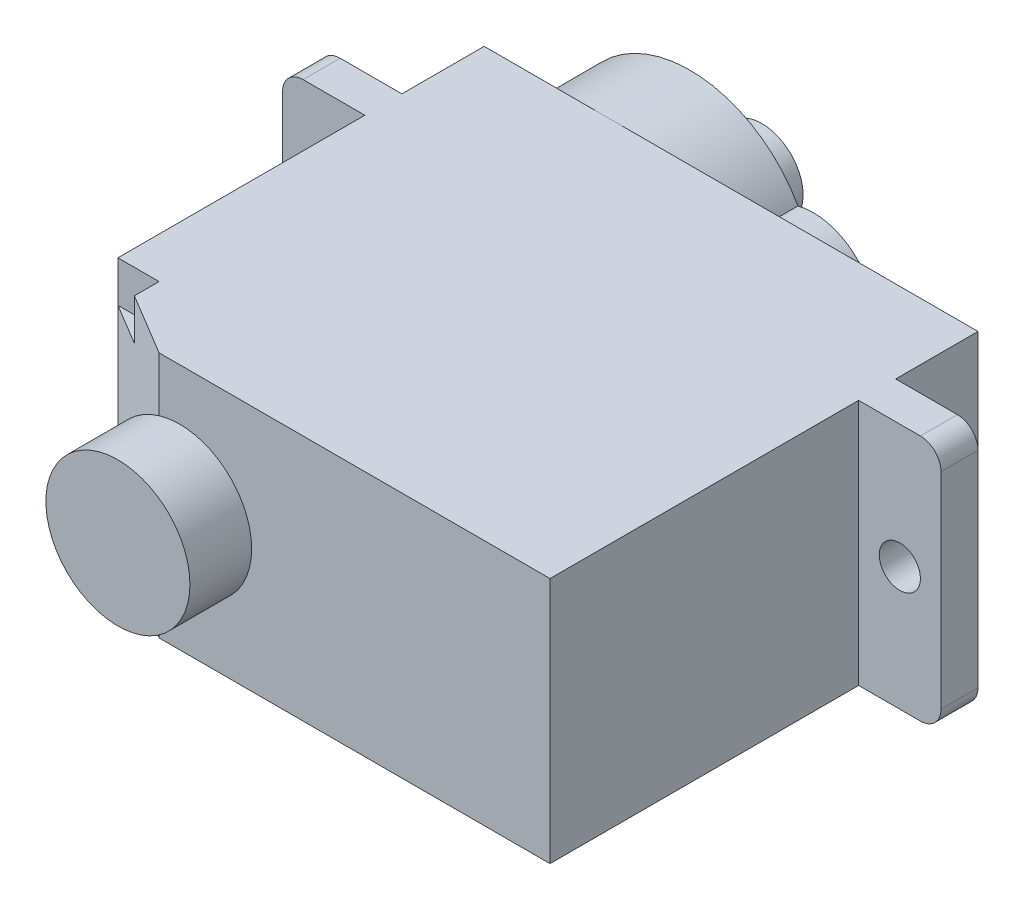
ISO-10303-21;
HEADER;
FILE_DESCRIPTION(('STEP AP214'),'2;1');
FILE_NAME('part.step','',(''),(''),'','','');
FILE_SCHEMA(('AUTOMOTIVE_DESIGN { 1 0 10303 214 1 1 1 1 }'));
ENDSEC;
DATA;
#1=APPLICATION_CONTEXT('core data for automotive mechanical design processes');
#2=APPLICATION_PROTOCOL_DEFINITION('international standard','automotive_design',2000,#1);
#3=PRODUCT_CONTEXT('',#1,'mechanical');
#4=PRODUCT('Part','Part','',(#3));
#5=PRODUCT_RELATED_PRODUCT_CATEGORY('part','',(#4));
#6=PRODUCT_DEFINITION_FORMATION('','',#4);
#7=PRODUCT_DEFINITION_CONTEXT('part definition',#1,'design');
#8=PRODUCT_DEFINITION('design','',#6,#7);
#9=PRODUCT_DEFINITION_SHAPE('','',#8);
#10=(LENGTH_UNIT() NAMED_UNIT(*) SI_UNIT(.MILLI.,.METRE.));
#11=(NAMED_UNIT(*) PLANE_ANGLE_UNIT() SI_UNIT($,.RADIAN.));
#12=(NAMED_UNIT(*) SI_UNIT($,.STERADIAN.) SOLID_ANGLE_UNIT());
#13=UNCERTAINTY_MEASURE_WITH_UNIT(LENGTH_MEASURE(1.E-05),#10,'distance_accuracy_value','');
#14=(GEOMETRIC_REPRESENTATION_CONTEXT(3) GLOBAL_UNCERTAINTY_ASSIGNED_CONTEXT((#13)) GLOBAL_UNIT_ASSIGNED_CONTEXT((#10,
#11,#12)) REPRESENTATION_CONTEXT('',''));
#15=CARTESIAN_POINT('',(0.,0.,0.));
#16=DIRECTION('',(0.,0.,1.));
#17=DIRECTION('',(1.,0.,0.));
#18=AXIS2_PLACEMENT_3D('',#15,#16,#17);
#19=CARTESIAN_POINT('',(0.,0.,12.));
#20=DIRECTION('',(0.,0.,-1.));
#21=DIRECTION('',(-1.,0.,0.));
#22=AXIS2_PLACEMENT_3D('',#19,#20,#21);
#23=PLANE('',#22);
#24=DIRECTION('',(0.,-1.,0.));
#25=VECTOR('',#24,1.);
#26=CARTESIAN_POINT('',(-10.,-6.,12.));
#27=LINE('',#26,#25);
#28=CARTESIAN_POINT('',(-10.,-4.,12.));
#29=VERTEX_POINT('',#28);
#30=CARTESIAN_POINT('',(-10.,-6.,12.));
#31=VERTEX_POINT('',#30);
#32=EDGE_CURVE('E254',#29,#31,#27,.T.);
#33=ORIENTED_EDGE('',*,*,#32,.F.);
#34=DIRECTION('',(1.,0.,0.));
#35=VECTOR('',#34,1.);
#36=CARTESIAN_POINT('',(-10.,-4.,12.));
#37=LINE('',#36,#35);
#38=CARTESIAN_POINT('',(-12.,-4.,12.));
#39=VERTEX_POINT('',#38);
#40=EDGE_CURVE('E264',#39,#29,#37,.T.);
#41=ORIENTED_EDGE('',*,*,#40,.F.);
#42=DIRECTION('',(0.,-1.,0.));
#43=VECTOR('',#42,1.);
#44=CARTESIAN_POINT('',(-12.,-6.,12.));
#45=LINE('',#44,#43);
#46=CARTESIAN_POINT('',(-12.,-6.,12.));
#47=VERTEX_POINT('',#46);
#48=EDGE_CURVE('E410',#39,#47,#45,.T.);
#49=ORIENTED_EDGE('',*,*,#48,.T.);
#50=DIRECTION('',(1.,0.,0.));
#51=VECTOR('',#50,1.);
#52=CARTESIAN_POINT('',(-12.,-6.,12.));
#53=LINE('',#52,#51);
#54=EDGE_CURVE('E415',#47,#31,#53,.T.);
#55=ORIENTED_EDGE('',*,*,#54,.T.);
#56=EDGE_LOOP('',(#33,#41,#49,#55));
#57=FACE_BOUND('',#56,.T.);
#58=ADVANCED_FACE('F36',(#57),#23,.F.);
#59=DIRECTION('',(-1.,0.,0.));
#60=VECTOR('',#59,1.);
#61=CARTESIAN_POINT('',(-12.,4.,12.));
#62=LINE('',#61,#60);
#63=CARTESIAN_POINT('',(-10.,4.,12.));
#64=VERTEX_POINT('',#63);
#65=CARTESIAN_POINT('',(-12.,4.,12.));
#66=VERTEX_POINT('',#65);
#67=EDGE_CURVE('E261',#64,#66,#62,.T.);
#68=ORIENTED_EDGE('',*,*,#67,.F.);
#69=DIRECTION('',(0.,-1.,0.));
#70=VECTOR('',#69,1.);
#71=CARTESIAN_POINT('',(-10.,4.,12.));
#72=LINE('',#71,#70);
#73=CARTESIAN_POINT('',(-10.,6.,12.));
#74=VERTEX_POINT('',#73);
#75=EDGE_CURVE('E251',#74,#64,#72,.T.);
#76=ORIENTED_EDGE('',*,*,#75,.F.);
#77=DIRECTION('',(-1.,0.,0.));
#78=VECTOR('',#77,1.);
#79=CARTESIAN_POINT('',(-12.,6.,12.));
#80=LINE('',#79,#78);
#81=CARTESIAN_POINT('',(-12.,6.,12.));
#82=VERTEX_POINT('',#81);
#83=EDGE_CURVE('E408',#74,#82,#80,.T.);
#84=ORIENTED_EDGE('',*,*,#83,.T.);
#85=EDGE_CURVE('E412',#82,#66,#45,.T.);
#86=ORIENTED_EDGE('',*,*,#85,.T.);
#87=EDGE_LOOP('',(#68,#76,#84,#86));
#88=FACE_BOUND('',#87,.T.);
#89=ADVANCED_FACE('F483',(#88),#23,.F.);
#90=CARTESIAN_POINT('',(0.,0.,-5.8));
#91=DIRECTION('',(0.,0.,1.));
#92=DIRECTION('',(1.,0.,0.));
#93=AXIS2_PLACEMENT_3D('',#90,#91,#92);
#94=PLANE('',#93);
#95=CARTESIAN_POINT('',(0.,0.,-5.8));
#96=DIRECTION('',(0.,0.,-1.));
#97=DIRECTION('',(-1.,0.,0.));
#98=AXIS2_PLACEMENT_3D('',#95,#96,#97);
#99=CIRCLE('',#98,3.);
#100=CARTESIAN_POINT('',(-0.75,-2.90473750965556,-5.8));
#101=VERTEX_POINT('',#100);
#102=CARTESIAN_POINT('',(-0.750000000000002,2.90473750965556,-5.8));
#103=VERTEX_POINT('',#102);
#104=EDGE_CURVE('E287',#101,#103,#99,.F.);
#105=ORIENTED_EDGE('',*,*,#104,.T.);
#106=CARTESIAN_POINT('',(-6.,0.,-5.8));
#107=DIRECTION('',(0.,0.,-1.));
#108=DIRECTION('',(-1.,0.,0.));
#109=AXIS2_PLACEMENT_3D('',#106,#107,#108);
#110=CIRCLE('',#109,6.);
#111=CARTESIAN_POINT('',(-6.,6.,-5.8));
#112=VERTEX_POINT('',#111);
#113=EDGE_CURVE('E279',#103,#112,#110,.F.);
#114=ORIENTED_EDGE('',*,*,#113,.T.);
#115=DIRECTION('',(-1.,0.,0.));
#116=VECTOR('',#115,1.);
#117=CARTESIAN_POINT('',(12.,6.,-5.8));
#118=LINE('',#117,#116);
#119=CARTESIAN_POINT('',(12.,6.,-5.8));
#120=VERTEX_POINT('',#119);
#121=EDGE_CURVE('E301',#120,#112,#118,.T.);
#122=ORIENTED_EDGE('',*,*,#121,.F.);
#123=DIRECTION('',(0.,-1.,0.));
#124=VECTOR('',#123,1.);
#125=CARTESIAN_POINT('',(12.,6.,-5.8));
#126=LINE('',#125,#124);
#127=CARTESIAN_POINT('',(12.,-6.,-5.8));
#128=VERTEX_POINT('',#127);
#129=EDGE_CURVE('E313',#120,#128,#126,.T.);
#130=ORIENTED_EDGE('',*,*,#129,.T.);
#131=DIRECTION('',(-1.,0.,0.));
#132=VECTOR('',#131,1.);
#133=CARTESIAN_POINT('',(12.,-6.,-5.8));
#134=LINE('',#133,#132);
#135=CARTESIAN_POINT('',(-6.,-6.,-5.8));
#136=VERTEX_POINT('',#135);
#137=EDGE_CURVE('E310',#128,#136,#134,.T.);
#138=ORIENTED_EDGE('',*,*,#137,.T.);
#139=EDGE_CURVE('E293',#136,#101,#110,.F.);
#140=ORIENTED_EDGE('',*,*,#139,.T.);
#141=EDGE_LOOP('',(#105,#114,#122,#130,#138,#140));
#142=FACE_BOUND('',#141,.T.);
#143=ADVANCED_FACE('F459',(#142),#94,.F.);
#144=CARTESIAN_POINT('',(-12.,6.,-5.8));
#145=VERTEX_POINT('',#144);
#146=EDGE_CURVE('E305',#112,#145,#118,.T.);
#147=ORIENTED_EDGE('',*,*,#146,.F.);
#148=CARTESIAN_POINT('',(-12.,0.,-5.8));
#149=VERTEX_POINT('',#148);
#150=EDGE_CURVE('E282',#112,#149,#110,.F.);
#151=ORIENTED_EDGE('',*,*,#150,.T.);
#152=DIRECTION('',(0.,-1.,0.));
#153=VECTOR('',#152,1.);
#154=CARTESIAN_POINT('',(-12.,6.,-5.8));
#155=LINE('',#154,#153);
#156=EDGE_CURVE('E306',#145,#149,#155,.T.);
#157=ORIENTED_EDGE('',*,*,#156,.F.);
#158=EDGE_LOOP('',(#147,#151,#157));
#159=FACE_BOUND('',#158,.T.);
#160=ADVANCED_FACE('F446',(#159),#94,.F.);
#161=CARTESIAN_POINT('',(15.,5.,-1.8));
#162=DIRECTION('',(0.,0.,-1.));
#163=DIRECTION('',(-1.,0.,0.));
#164=AXIS2_PLACEMENT_3D('',#161,#162,#163);
#165=PLANE('',#164);
#166=CARTESIAN_POINT('',(-14.,0.,-1.8));
#167=DIRECTION('',(0.,0.,-1.));
#168=DIRECTION('',(-1.,0.,0.));
#169=AXIS2_PLACEMENT_3D('',#166,#167,#168);
#170=CIRCLE('',#169,1.);
#171=CARTESIAN_POINT('',(-15.,0.,-1.8));
#172=VERTEX_POINT('',#171);
#173=EDGE_CURVE('E338',#172,#172,#170,.T.);
#174=ORIENTED_EDGE('',*,*,#173,.F.);
#175=EDGE_LOOP('',(#174));
#176=FACE_BOUND('',#175,.T.);
#177=DIRECTION('',(1.,0.,0.));
#178=VECTOR('',#177,1.);
#179=CARTESIAN_POINT('',(-12.,6.,-1.8));
#180=LINE('',#179,#178);
#181=CARTESIAN_POINT('',(-15.,6.,-1.8));
#182=VERTEX_POINT('',#181);
#183=CARTESIAN_POINT('',(-12.,6.,-1.8));
#184=VERTEX_POINT('',#183);
#185=EDGE_CURVE('E344',#182,#184,#180,.T.);
#186=ORIENTED_EDGE('',*,*,#185,.T.);
#187=DIRECTION('',(0.,-1.,0.));
#188=VECTOR('',#187,1.);
#189=CARTESIAN_POINT('',(-12.,6.,-1.8));
#190=LINE('',#189,#188);
#191=CARTESIAN_POINT('',(-12.,-5.99999999999999,-1.8));
#192=VERTEX_POINT('',#191);
#193=EDGE_CURVE('E300',#184,#192,#190,.T.);
#194=ORIENTED_EDGE('',*,*,#193,.T.);
#195=DIRECTION('',(-1.,0.,0.));
#196=VECTOR('',#195,1.);
#197=CARTESIAN_POINT('',(12.,-6.,-1.8));
#198=LINE('',#197,#196);
#199=CARTESIAN_POINT('',(-15.,-6.,-1.8));
#200=VERTEX_POINT('',#199);
#201=EDGE_CURVE('E353',#192,#200,#198,.T.);
#202=ORIENTED_EDGE('',*,*,#201,.T.);
#203=CARTESIAN_POINT('',(-15.,-5.,-1.8));
#204=DIRECTION('',(0.,0.,-1.));
#205=DIRECTION('',(-1.,0.,0.));
#206=AXIS2_PLACEMENT_3D('',#203,#204,#205);
#207=CIRCLE('',#206,1.);
#208=CARTESIAN_POINT('',(-16.,-4.99999999999999,-1.8));
#209=VERTEX_POINT('',#208);
#210=EDGE_CURVE('E356',#200,#209,#207,.T.);
#211=ORIENTED_EDGE('',*,*,#210,.T.);
#212=DIRECTION('',(0.,1.,0.));
#213=VECTOR('',#212,1.);
#214=CARTESIAN_POINT('',(-16.,-4.99999999999999,-1.8));
#215=LINE('',#214,#213);
#216=CARTESIAN_POINT('',(-16.,4.99999999999999,-1.8));
#217=VERTEX_POINT('',#216);
#218=EDGE_CURVE('E358',#209,#217,#215,.T.);
#219=ORIENTED_EDGE('',*,*,#218,.T.);
#220=CARTESIAN_POINT('',(-15.,5.,-1.8));
#221=DIRECTION('',(0.,0.,-1.));
#222=DIRECTION('',(1.,0.,0.));
#223=AXIS2_PLACEMENT_3D('',#220,#221,#222);
#224=CIRCLE('',#223,1.);
#225=EDGE_CURVE('E360',#217,#182,#224,.T.);
#226=ORIENTED_EDGE('',*,*,#225,.T.);
#227=EDGE_LOOP('',(#186,#194,#202,#211,#219,#226));
#228=FACE_BOUND('',#227,.T.);
#229=ADVANCED_FACE('F506',(#176,#228),#165,.T.);
#230=CARTESIAN_POINT('',(12.,-6.,12.));
#231=DIRECTION('',(-1.,0.,0.));
#232=DIRECTION('',(0.,0.,1.));
#233=AXIS2_PLACEMENT_3D('',#230,#231,#232);
#234=PLANE('',#233);
#235=DIRECTION('',(0.,1.,0.));
#236=VECTOR('',#235,1.);
#237=CARTESIAN_POINT('',(12.,-6.,0.));
#238=LINE('',#237,#236);
#239=CARTESIAN_POINT('',(12.,-6.,0.));
#240=VERTEX_POINT('',#239);
#241=CARTESIAN_POINT('',(12.,6.,0.));
#242=VERTEX_POINT('',#241);
#243=EDGE_CURVE('E407',#240,#242,#238,.T.);
#244=ORIENTED_EDGE('',*,*,#243,.T.);
#245=DIRECTION('',(0.,0.,-1.));
#246=VECTOR('',#245,1.);
#247=CARTESIAN_POINT('',(12.,6.,12.));
#248=LINE('',#247,#246);
#249=CARTESIAN_POINT('',(12.,6.,15.));
#250=VERTEX_POINT('',#249);
#251=EDGE_CURVE('E40',#250,#242,#248,.T.);
#252=ORIENTED_EDGE('',*,*,#251,.F.);
#253=DIRECTION('',(0.,1.,0.));
#254=VECTOR('',#253,1.);
#255=CARTESIAN_POINT('',(12.,-6.,15.));
#256=LINE('',#255,#254);
#257=CARTESIAN_POINT('',(12.,-6.,15.));
#258=VERTEX_POINT('',#257);
#259=EDGE_CURVE('E256',#258,#250,#256,.T.);
#260=ORIENTED_EDGE('',*,*,#259,.F.);
#261=DIRECTION('',(0.,0.,-1.));
#262=VECTOR('',#261,1.);
#263=CARTESIAN_POINT('',(12.,-6.,12.));
#264=LINE('',#263,#262);
#265=EDGE_CURVE('E418',#258,#240,#264,.T.);
#266=ORIENTED_EDGE('',*,*,#265,.T.);
#267=EDGE_LOOP('',(#244,#252,#260,#266));
#268=FACE_BOUND('',#267,.T.);
#269=ADVANCED_FACE('F38',(#268),#234,.F.);
#270=CARTESIAN_POINT('',(-12.,6.,12.));
#271=DIRECTION('',(0.,-1.,0.));
#272=DIRECTION('',(0.,0.,-1.));
#273=AXIS2_PLACEMENT_3D('',#270,#271,#272);
#274=PLANE('',#273);
#275=DIRECTION('',(0.,0.,-1.));
#276=VECTOR('',#275,1.);
#277=CARTESIAN_POINT('',(-10.,6.,15.));
#278=LINE('',#277,#276);
#279=CARTESIAN_POINT('',(-10.,6.,13.2));
#280=VERTEX_POINT('',#279);
#281=EDGE_CURVE('E274',#280,#74,#278,.T.);
#282=ORIENTED_EDGE('',*,*,#281,.F.);
#283=DIRECTION('',(-0.857492925712544,0.,-0.514495755427526));
#284=VECTOR('',#283,1.);
#285=CARTESIAN_POINT('',(-7.,6.,15.));
#286=LINE('',#285,#284);
#287=CARTESIAN_POINT('',(-7.,6.,15.));
#288=VERTEX_POINT('',#287);
#289=EDGE_CURVE('E231',#288,#280,#286,.T.);
#290=ORIENTED_EDGE('',*,*,#289,.F.);
#291=DIRECTION('',(-1.,0.,0.));
#292=VECTOR('',#291,1.);
#293=CARTESIAN_POINT('',(-10.,6.,15.));
#294=LINE('',#293,#292);
#295=EDGE_CURVE('E225',#250,#288,#294,.T.);
#296=ORIENTED_EDGE('',*,*,#295,.F.);
#297=ORIENTED_EDGE('',*,*,#251,.T.);
#298=DIRECTION('',(1.,0.,0.));
#299=VECTOR('',#298,1.);
#300=CARTESIAN_POINT('',(-12.,6.,0.));
#301=LINE('',#300,#299);
#302=CARTESIAN_POINT('',(15.,6.,0.));
#303=VERTEX_POINT('',#302);
#304=EDGE_CURVE('E380',#242,#303,#301,.T.);
#305=ORIENTED_EDGE('',*,*,#304,.T.);
#306=DIRECTION('',(0.,0.,1.));
#307=VECTOR('',#306,1.);
#308=CARTESIAN_POINT('',(15.,6.,-1.8));
#309=LINE('',#308,#307);
#310=CARTESIAN_POINT('',(15.,6.,-1.8));
#311=VERTEX_POINT('',#310);
#312=EDGE_CURVE('E404',#311,#303,#309,.T.);
#313=ORIENTED_EDGE('',*,*,#312,.F.);
#314=CARTESIAN_POINT('',(12.,6.,-1.8));
#315=VERTEX_POINT('',#314);
#316=EDGE_CURVE('E347',#315,#311,#180,.T.);
#317=ORIENTED_EDGE('',*,*,#316,.F.);
#318=DIRECTION('',(0.,0.,1.));
#319=VECTOR('',#318,1.);
#320=CARTESIAN_POINT('',(12.,6.,-5.8));
#321=LINE('',#320,#319);
#322=EDGE_CURVE('E320',#120,#315,#321,.T.);
#323=ORIENTED_EDGE('',*,*,#322,.F.);
#324=ORIENTED_EDGE('',*,*,#121,.T.);
#325=ORIENTED_EDGE('',*,*,#146,.T.);
#326=DIRECTION('',(0.,0.,1.));
#327=VECTOR('',#326,1.);
#328=CARTESIAN_POINT('',(-12.,6.,-5.8));
#329=LINE('',#328,#327);
#330=EDGE_CURVE('E315',#145,#184,#329,.T.);
#331=ORIENTED_EDGE('',*,*,#330,.T.);
#332=ORIENTED_EDGE('',*,*,#185,.F.);
#333=DIRECTION('',(0.,0.,1.));
#334=VECTOR('',#333,1.);
#335=CARTESIAN_POINT('',(-15.,6.,-1.8));
#336=LINE('',#335,#334);
#337=CARTESIAN_POINT('',(-15.,6.,0.));
#338=VERTEX_POINT('',#337);
#339=EDGE_CURVE('E363',#182,#338,#336,.T.);
#340=ORIENTED_EDGE('',*,*,#339,.T.);
#341=CARTESIAN_POINT('',(-12.,6.,0.));
#342=VERTEX_POINT('',#341);
#343=EDGE_CURVE('E381',#338,#342,#301,.T.);
#344=ORIENTED_EDGE('',*,*,#343,.T.);
#345=DIRECTION('',(0.,0.,-1.));
#346=VECTOR('',#345,1.);
#347=CARTESIAN_POINT('',(-12.,6.,12.));
#348=LINE('',#347,#346);
#349=EDGE_CURVE('E427',#82,#342,#348,.T.);
#350=ORIENTED_EDGE('',*,*,#349,.F.);
#351=ORIENTED_EDGE('',*,*,#83,.F.);
#352=EDGE_LOOP('',(#282,#290,#296,#297,#305,#313,#317,#323,#324,#325,#331,#332,#340,#344,#350,#351));
#353=FACE_BOUND('',#352,.T.);
#354=ADVANCED_FACE('F455',(#353),#274,.F.);
#355=CARTESIAN_POINT('',(-12.,-6.,12.));
#356=DIRECTION('',(1.,0.,0.));
#357=DIRECTION('',(0.,0.,-1.));
#358=AXIS2_PLACEMENT_3D('',#355,#356,#357);
#359=PLANE('',#358);
#360=ORIENTED_EDGE('',*,*,#48,.F.);
#361=DIRECTION('',(0.,1.,0.));
#362=VECTOR('',#361,1.);
#363=CARTESIAN_POINT('',(-12.,-6.,12.));
#364=LINE('',#363,#362);
#365=EDGE_CURVE('E236',#39,#66,#364,.T.);
#366=ORIENTED_EDGE('',*,*,#365,.T.);
#367=ORIENTED_EDGE('',*,*,#85,.F.);
#368=ORIENTED_EDGE('',*,*,#349,.T.);
#369=DIRECTION('',(0.,-1.,0.));
#370=VECTOR('',#369,1.);
#371=CARTESIAN_POINT('',(-12.,-6.,0.));
#372=LINE('',#371,#370);
#373=CARTESIAN_POINT('',(-12.,-6.,0.));
#374=VERTEX_POINT('',#373);
#375=EDGE_CURVE('E411',#342,#374,#372,.T.);
#376=ORIENTED_EDGE('',*,*,#375,.T.);
#377=DIRECTION('',(0.,0.,-1.));
#378=VECTOR('',#377,1.);
#379=CARTESIAN_POINT('',(-12.,-6.,12.));
#380=LINE('',#379,#378);
#381=EDGE_CURVE('E425',#47,#374,#380,.T.);
#382=ORIENTED_EDGE('',*,*,#381,.F.);
#383=EDGE_LOOP('',(#360,#366,#367,#368,#376,#382));
#384=FACE_BOUND('',#383,.T.);
#385=ADVANCED_FACE('F499',(#384),#359,.F.);
#386=CARTESIAN_POINT('',(-12.,-6.,12.));
#387=DIRECTION('',(0.,1.,0.));
#388=DIRECTION('',(0.,0.,1.));
#389=AXIS2_PLACEMENT_3D('',#386,#387,#388);
#390=PLANE('',#389);
#391=DIRECTION('',(1.,0.,0.));
#392=VECTOR('',#391,1.);
#393=CARTESIAN_POINT('',(12.,-6.,15.));
#394=LINE('',#393,#392);
#395=CARTESIAN_POINT('',(-7.,-6.,15.));
#396=VERTEX_POINT('',#395);
#397=EDGE_CURVE('E253',#396,#258,#394,.T.);
#398=ORIENTED_EDGE('',*,*,#397,.F.);
#399=DIRECTION('',(-0.857492925712544,0.,-0.514495755427526));
#400=VECTOR('',#399,1.);
#401=CARTESIAN_POINT('',(-7.,-6.,15.));
#402=LINE('',#401,#400);
#403=CARTESIAN_POINT('',(-10.,-6.,13.2));
#404=VERTEX_POINT('',#403);
#405=EDGE_CURVE('E59',#396,#404,#402,.T.);
#406=ORIENTED_EDGE('',*,*,#405,.T.);
#407=DIRECTION('',(0.,0.,-1.));
#408=VECTOR('',#407,1.);
#409=CARTESIAN_POINT('',(-10.,-6.,15.));
#410=LINE('',#409,#408);
#411=EDGE_CURVE('E258',#404,#31,#410,.T.);
#412=ORIENTED_EDGE('',*,*,#411,.T.);
#413=ORIENTED_EDGE('',*,*,#54,.F.);
#414=ORIENTED_EDGE('',*,*,#381,.T.);
#415=DIRECTION('',(-1.,0.,0.));
#416=VECTOR('',#415,1.);
#417=CARTESIAN_POINT('',(-12.,-6.,0.));
#418=LINE('',#417,#416);
#419=CARTESIAN_POINT('',(-15.,-6.,0.));
#420=VERTEX_POINT('',#419);
#421=EDGE_CURVE('E370',#374,#420,#418,.T.);
#422=ORIENTED_EDGE('',*,*,#421,.T.);
#423=DIRECTION('',(0.,0.,1.));
#424=VECTOR('',#423,1.);
#425=CARTESIAN_POINT('',(-15.,-6.,-1.8));
#426=LINE('',#425,#424);
#427=EDGE_CURVE('E392',#200,#420,#426,.T.);
#428=ORIENTED_EDGE('',*,*,#427,.F.);
#429=ORIENTED_EDGE('',*,*,#201,.F.);
#430=DIRECTION('',(0.,0.,1.));
#431=VECTOR('',#430,1.);
#432=CARTESIAN_POINT('',(-12.,-6.,-5.8));
#433=LINE('',#432,#431);
#434=CARTESIAN_POINT('',(-12.,-6.,-5.8));
#435=VERTEX_POINT('',#434);
#436=EDGE_CURVE('E327',#435,#192,#433,.T.);
#437=ORIENTED_EDGE('',*,*,#436,.F.);
#438=EDGE_CURVE('E309',#136,#435,#134,.T.);
#439=ORIENTED_EDGE('',*,*,#438,.F.);
#440=ORIENTED_EDGE('',*,*,#137,.F.);
#441=DIRECTION('',(0.,0.,1.));
#442=VECTOR('',#441,1.);
#443=CARTESIAN_POINT('',(12.,-6.,-5.8));
#444=LINE('',#443,#442);
#445=CARTESIAN_POINT('',(12.,-6.,-1.8));
#446=VERTEX_POINT('',#445);
#447=EDGE_CURVE('E324',#128,#446,#444,.T.);
#448=ORIENTED_EDGE('',*,*,#447,.T.);
#449=CARTESIAN_POINT('',(15.,-6.,-1.8));
#450=VERTEX_POINT('',#449);
#451=EDGE_CURVE('E354',#450,#446,#198,.T.);
#452=ORIENTED_EDGE('',*,*,#451,.F.);
#453=DIRECTION('',(0.,0.,1.));
#454=VECTOR('',#453,1.);
#455=CARTESIAN_POINT('',(15.,-6.,-1.8));
#456=LINE('',#455,#454);
#457=CARTESIAN_POINT('',(15.,-6.,0.));
#458=VERTEX_POINT('',#457);
#459=EDGE_CURVE('E395',#450,#458,#456,.T.);
#460=ORIENTED_EDGE('',*,*,#459,.T.);
#461=EDGE_CURVE('E371',#458,#240,#418,.T.);
#462=ORIENTED_EDGE('',*,*,#461,.T.);
#463=ORIENTED_EDGE('',*,*,#265,.F.);
#464=EDGE_LOOP('',(#398,#406,#412,#413,#414,#422,#428,#429,#437,#439,#440,#448,#452,#460,#462,#463));
#465=FACE_BOUND('',#464,.T.);
#466=ADVANCED_FACE('F495',(#465),#390,.F.);
#467=CARTESIAN_POINT('',(15.,5.,0.));
#468=DIRECTION('',(0.,0.,-1.));
#469=DIRECTION('',(-1.,0.,0.));
#470=AXIS2_PLACEMENT_3D('',#467,#468,#469);
#471=PLANE('',#470);
#472=ORIENTED_EDGE('',*,*,#243,.F.);
#473=ORIENTED_EDGE('',*,*,#461,.F.);
#474=CARTESIAN_POINT('',(15.,-5.,0.));
#475=DIRECTION('',(0.,0.,-1.));
#476=DIRECTION('',(1.,0.,0.));
#477=AXIS2_PLACEMENT_3D('',#474,#475,#476);
#478=CIRCLE('',#477,1.);
#479=CARTESIAN_POINT('',(16.,-5.,0.));
#480=VERTEX_POINT('',#479);
#481=EDGE_CURVE('E367',#480,#458,#478,.T.);
#482=ORIENTED_EDGE('',*,*,#481,.F.);
#483=DIRECTION('',(0.,-1.,0.));
#484=VECTOR('',#483,1.);
#485=CARTESIAN_POINT('',(16.,4.99999999999999,0.));
#486=LINE('',#485,#484);
#487=CARTESIAN_POINT('',(16.,4.99999999999999,0.));
#488=VERTEX_POINT('',#487);
#489=EDGE_CURVE('E365',#488,#480,#486,.T.);
#490=ORIENTED_EDGE('',*,*,#489,.F.);
#491=CARTESIAN_POINT('',(15.,5.,0.));
#492=DIRECTION('',(0.,0.,-1.));
#493=DIRECTION('',(-1.,0.,0.));
#494=AXIS2_PLACEMENT_3D('',#491,#492,#493);
#495=CIRCLE('',#494,1.);
#496=EDGE_CURVE('E341',#303,#488,#495,.T.);
#497=ORIENTED_EDGE('',*,*,#496,.F.);
#498=ORIENTED_EDGE('',*,*,#304,.F.);
#499=EDGE_LOOP('',(#472,#473,#482,#490,#497,#498));
#500=FACE_BOUND('',#499,.T.);
#501=CARTESIAN_POINT('',(14.,0.,0.));
#502=DIRECTION('',(0.,0.,-1.));
#503=DIRECTION('',(-1.,0.,0.));
#504=AXIS2_PLACEMENT_3D('',#501,#502,#503);
#505=CIRCLE('',#504,1.);
#506=CARTESIAN_POINT('',(13.,0.,0.));
#507=VERTEX_POINT('',#506);
#508=EDGE_CURVE('E323',#507,#507,#505,.T.);
#509=ORIENTED_EDGE('',*,*,#508,.T.);
#510=EDGE_LOOP('',(#509));
#511=FACE_BOUND('',#510,.T.);
#512=ADVANCED_FACE('F498',(#500,#511),#471,.F.);
#513=DIRECTION('',(0.,-1.,0.));
#514=VECTOR('',#513,1.);
#515=CARTESIAN_POINT('',(12.,6.,-1.8));
#516=LINE('',#515,#514);
#517=EDGE_CURVE('E317',#315,#446,#516,.T.);
#518=ORIENTED_EDGE('',*,*,#517,.F.);
#519=ORIENTED_EDGE('',*,*,#316,.T.);
#520=CARTESIAN_POINT('',(15.,5.,-1.8));
#521=DIRECTION('',(0.,0.,-1.));
#522=DIRECTION('',(-1.,0.,0.));
#523=AXIS2_PLACEMENT_3D('',#520,#521,#522);
#524=CIRCLE('',#523,1.);
#525=CARTESIAN_POINT('',(16.,4.99999999999999,-1.8));
#526=VERTEX_POINT('',#525);
#527=EDGE_CURVE('E346',#311,#526,#524,.T.);
#528=ORIENTED_EDGE('',*,*,#527,.T.);
#529=DIRECTION('',(0.,-1.,0.));
#530=VECTOR('',#529,1.);
#531=CARTESIAN_POINT('',(16.,4.99999999999999,-1.8));
#532=LINE('',#531,#530);
#533=CARTESIAN_POINT('',(16.,-5.,-1.8));
#534=VERTEX_POINT('',#533);
#535=EDGE_CURVE('E349',#526,#534,#532,.T.);
#536=ORIENTED_EDGE('',*,*,#535,.T.);
#537=CARTESIAN_POINT('',(15.,-5.,-1.8));
#538=DIRECTION('',(0.,0.,-1.));
#539=DIRECTION('',(1.,0.,0.));
#540=AXIS2_PLACEMENT_3D('',#537,#538,#539);
#541=CIRCLE('',#540,1.);
#542=EDGE_CURVE('E351',#534,#450,#541,.T.);
#543=ORIENTED_EDGE('',*,*,#542,.T.);
#544=ORIENTED_EDGE('',*,*,#451,.T.);
#545=EDGE_LOOP('',(#518,#519,#528,#536,#543,#544));
#546=FACE_BOUND('',#545,.T.);
#547=CARTESIAN_POINT('',(14.,0.,-1.8));
#548=DIRECTION('',(0.,0.,-1.));
#549=DIRECTION('',(-1.,0.,0.));
#550=AXIS2_PLACEMENT_3D('',#547,#548,#549);
#551=CIRCLE('',#550,1.);
#552=CARTESIAN_POINT('',(13.,0.,-1.8));
#553=VERTEX_POINT('',#552);
#554=EDGE_CURVE('E332',#553,#553,#551,.T.);
#555=ORIENTED_EDGE('',*,*,#554,.F.);
#556=EDGE_LOOP('',(#555));
#557=FACE_BOUND('',#556,.T.);
#558=ADVANCED_FACE('F513',(#546,#557),#165,.T.);
#559=ORIENTED_EDGE('',*,*,#375,.F.);
#560=ORIENTED_EDGE('',*,*,#343,.F.);
#561=CARTESIAN_POINT('',(-15.,5.,0.));
#562=DIRECTION('',(0.,0.,-1.));
#563=DIRECTION('',(1.,0.,0.));
#564=AXIS2_PLACEMENT_3D('',#561,#562,#563);
#565=CIRCLE('',#564,1.);
#566=CARTESIAN_POINT('',(-16.,4.99999999999999,0.));
#567=VERTEX_POINT('',#566);
#568=EDGE_CURVE('E378',#567,#338,#565,.T.);
#569=ORIENTED_EDGE('',*,*,#568,.F.);
#570=DIRECTION('',(0.,1.,0.));
#571=VECTOR('',#570,1.);
#572=CARTESIAN_POINT('',(-16.,-4.99999999999999,0.));
#573=LINE('',#572,#571);
#574=CARTESIAN_POINT('',(-16.,-4.99999999999999,0.));
#575=VERTEX_POINT('',#574);
#576=EDGE_CURVE('E376',#575,#567,#573,.T.);
#577=ORIENTED_EDGE('',*,*,#576,.F.);
#578=CARTESIAN_POINT('',(-15.,-5.,0.));
#579=DIRECTION('',(0.,0.,-1.));
#580=DIRECTION('',(-1.,0.,0.));
#581=AXIS2_PLACEMENT_3D('',#578,#579,#580);
#582=CIRCLE('',#581,1.);
#583=EDGE_CURVE('E374',#420,#575,#582,.T.);
#584=ORIENTED_EDGE('',*,*,#583,.F.);
#585=ORIENTED_EDGE('',*,*,#421,.F.);
#586=EDGE_LOOP('',(#559,#560,#569,#577,#584,#585));
#587=FACE_BOUND('',#586,.T.);
#588=CARTESIAN_POINT('',(-14.,0.,0.));
#589=DIRECTION('',(0.,0.,-1.));
#590=DIRECTION('',(-1.,0.,0.));
#591=AXIS2_PLACEMENT_3D('',#588,#589,#590);
#592=CIRCLE('',#591,1.);
#593=CARTESIAN_POINT('',(-15.,0.,0.));
#594=VERTEX_POINT('',#593);
#595=EDGE_CURVE('E335',#594,#594,#592,.T.);
#596=ORIENTED_EDGE('',*,*,#595,.T.);
#597=EDGE_LOOP('',(#596));
#598=FACE_BOUND('',#597,.T.);
#599=ADVANCED_FACE('F553',(#587,#598),#471,.F.);
#600=CARTESIAN_POINT('',(15.,5.,-1.8));
#601=DIRECTION('',(0.,0.,1.));
#602=DIRECTION('',(1.,0.,0.));
#603=AXIS2_PLACEMENT_3D('',#600,#601,#602);
#604=CYLINDRICAL_SURFACE('',#603,1.);
#605=ORIENTED_EDGE('',*,*,#496,.T.);
#606=DIRECTION('',(0.,0.,1.));
#607=VECTOR('',#606,1.);
#608=CARTESIAN_POINT('',(16.,4.99999999999999,-1.8));
#609=LINE('',#608,#607);
#610=EDGE_CURVE('E401',#526,#488,#609,.T.);
#611=ORIENTED_EDGE('',*,*,#610,.F.);
#612=ORIENTED_EDGE('',*,*,#527,.F.);
#613=ORIENTED_EDGE('',*,*,#312,.T.);
#614=EDGE_LOOP('',(#605,#611,#612,#613));
#615=FACE_BOUND('',#614,.T.);
#616=ADVANCED_FACE('F493',(#615),#604,.T.);
#617=CARTESIAN_POINT('',(16.,4.99999999999999,-1.8));
#618=DIRECTION('',(-1.,0.,0.));
#619=DIRECTION('',(0.,0.,1.));
#620=AXIS2_PLACEMENT_3D('',#617,#618,#619);
#621=PLANE('',#620);
#622=ORIENTED_EDGE('',*,*,#489,.T.);
#623=DIRECTION('',(0.,0.,1.));
#624=VECTOR('',#623,1.);
#625=CARTESIAN_POINT('',(16.,-5.,-1.8));
#626=LINE('',#625,#624);
#627=EDGE_CURVE('E398',#534,#480,#626,.T.);
#628=ORIENTED_EDGE('',*,*,#627,.F.);
#629=ORIENTED_EDGE('',*,*,#535,.F.);
#630=ORIENTED_EDGE('',*,*,#610,.T.);
#631=EDGE_LOOP('',(#622,#628,#629,#630));
#632=FACE_BOUND('',#631,.T.);
#633=ADVANCED_FACE('F529',(#632),#621,.F.);
#634=CARTESIAN_POINT('',(15.,-5.,-1.8));
#635=DIRECTION('',(0.,0.,1.));
#636=DIRECTION('',(1.,0.,0.));
#637=AXIS2_PLACEMENT_3D('',#634,#635,#636);
#638=CYLINDRICAL_SURFACE('',#637,1.);
#639=ORIENTED_EDGE('',*,*,#481,.T.);
#640=ORIENTED_EDGE('',*,*,#459,.F.);
#641=ORIENTED_EDGE('',*,*,#542,.F.);
#642=ORIENTED_EDGE('',*,*,#627,.T.);
#643=EDGE_LOOP('',(#639,#640,#641,#642));
#644=FACE_BOUND('',#643,.T.);
#645=ADVANCED_FACE('F525',(#644),#638,.T.);
#646=CARTESIAN_POINT('',(-15.,-5.,-1.8));
#647=DIRECTION('',(0.,0.,1.));
#648=DIRECTION('',(1.,0.,0.));
#649=AXIS2_PLACEMENT_3D('',#646,#647,#648);
#650=CYLINDRICAL_SURFACE('',#649,1.);
#651=ORIENTED_EDGE('',*,*,#583,.T.);
#652=DIRECTION('',(0.,0.,1.));
#653=VECTOR('',#652,1.);
#654=CARTESIAN_POINT('',(-16.,-4.99999999999999,-1.8));
#655=LINE('',#654,#653);
#656=EDGE_CURVE('E389',#209,#575,#655,.T.);
#657=ORIENTED_EDGE('',*,*,#656,.F.);
#658=ORIENTED_EDGE('',*,*,#210,.F.);
#659=ORIENTED_EDGE('',*,*,#427,.T.);
#660=EDGE_LOOP('',(#651,#657,#658,#659));
#661=FACE_BOUND('',#660,.T.);
#662=ADVANCED_FACE('F846',(#661),#650,.T.);
#663=CARTESIAN_POINT('',(-16.,-4.99999999999999,-1.8));
#664=DIRECTION('',(1.,0.,0.));
#665=DIRECTION('',(0.,0.,-1.));
#666=AXIS2_PLACEMENT_3D('',#663,#664,#665);
#667=PLANE('',#666);
#668=ORIENTED_EDGE('',*,*,#576,.T.);
#669=DIRECTION('',(0.,0.,1.));
#670=VECTOR('',#669,1.);
#671=CARTESIAN_POINT('',(-16.,4.99999999999999,-1.8));
#672=LINE('',#671,#670);
#673=EDGE_CURVE('E386',#217,#567,#672,.T.);
#674=ORIENTED_EDGE('',*,*,#673,.F.);
#675=ORIENTED_EDGE('',*,*,#218,.F.);
#676=ORIENTED_EDGE('',*,*,#656,.T.);
#677=EDGE_LOOP('',(#668,#674,#675,#676));
#678=FACE_BOUND('',#677,.T.);
#679=ADVANCED_FACE('F836',(#678),#667,.F.);
#680=CARTESIAN_POINT('',(-15.,5.,-1.8));
#681=DIRECTION('',(0.,0.,1.));
#682=DIRECTION('',(1.,0.,0.));
#683=AXIS2_PLACEMENT_3D('',#680,#681,#682);
#684=CYLINDRICAL_SURFACE('',#683,1.);
#685=ORIENTED_EDGE('',*,*,#568,.T.);
#686=ORIENTED_EDGE('',*,*,#339,.F.);
#687=ORIENTED_EDGE('',*,*,#225,.F.);
#688=ORIENTED_EDGE('',*,*,#673,.T.);
#689=EDGE_LOOP('',(#685,#686,#687,#688));
#690=FACE_BOUND('',#689,.T.);
#691=ADVANCED_FACE('F549',(#690),#684,.T.);
#692=CARTESIAN_POINT('',(-14.,0.,-1.8));
#693=DIRECTION('',(0.,0.,1.));
#694=DIRECTION('',(1.,0.,0.));
#695=AXIS2_PLACEMENT_3D('',#692,#693,#694);
#696=CYLINDRICAL_SURFACE('',#695,1.);
#697=ORIENTED_EDGE('',*,*,#173,.T.);
#698=EDGE_LOOP('',(#697));
#699=FACE_BOUND('',#698,.T.);
#700=ORIENTED_EDGE('',*,*,#595,.F.);
#701=EDGE_LOOP('',(#700));
#702=FACE_BOUND('',#701,.T.);
#703=ADVANCED_FACE('F815',(#699,#702),#696,.F.);
#704=CARTESIAN_POINT('',(14.,0.,-1.8));
#705=DIRECTION('',(0.,0.,1.));
#706=DIRECTION('',(1.,0.,0.));
#707=AXIS2_PLACEMENT_3D('',#704,#705,#706);
#708=CYLINDRICAL_SURFACE('',#707,1.);
#709=ORIENTED_EDGE('',*,*,#554,.T.);
#710=EDGE_LOOP('',(#709));
#711=FACE_BOUND('',#710,.T.);
#712=ORIENTED_EDGE('',*,*,#508,.F.);
#713=EDGE_LOOP('',(#712));
#714=FACE_BOUND('',#713,.T.);
#715=ADVANCED_FACE('F788',(#711,#714),#708,.F.);
#716=CARTESIAN_POINT('',(12.,6.,-5.8));
#717=DIRECTION('',(-1.,0.,0.));
#718=DIRECTION('',(0.,0.,1.));
#719=AXIS2_PLACEMENT_3D('',#716,#717,#718);
#720=PLANE('',#719);
#721=ORIENTED_EDGE('',*,*,#517,.T.);
#722=ORIENTED_EDGE('',*,*,#447,.F.);
#723=ORIENTED_EDGE('',*,*,#129,.F.);
#724=ORIENTED_EDGE('',*,*,#322,.T.);
#725=EDGE_LOOP('',(#721,#722,#723,#724));
#726=FACE_BOUND('',#725,.T.);
#727=ADVANCED_FACE('F537',(#726),#720,.F.);
#728=CARTESIAN_POINT('',(-12.,6.,-5.8));
#729=DIRECTION('',(-1.,0.,0.));
#730=DIRECTION('',(0.,0.,1.));
#731=AXIS2_PLACEMENT_3D('',#728,#729,#730);
#732=PLANE('',#731);
#733=ORIENTED_EDGE('',*,*,#193,.F.);
#734=ORIENTED_EDGE('',*,*,#330,.F.);
#735=ORIENTED_EDGE('',*,*,#156,.T.);
#736=EDGE_CURVE('E304',#149,#435,#155,.T.);
#737=ORIENTED_EDGE('',*,*,#736,.T.);
#738=ORIENTED_EDGE('',*,*,#436,.T.);
#739=EDGE_LOOP('',(#733,#734,#735,#737,#738));
#740=FACE_BOUND('',#739,.T.);
#741=ADVANCED_FACE('F453',(#740),#732,.T.);
#742=ORIENTED_EDGE('',*,*,#736,.F.);
#743=EDGE_CURVE('E435',#149,#136,#110,.F.);
#744=ORIENTED_EDGE('',*,*,#743,.T.);
#745=ORIENTED_EDGE('',*,*,#438,.T.);
#746=EDGE_LOOP('',(#742,#744,#745));
#747=FACE_BOUND('',#746,.T.);
#748=ADVANCED_FACE('F448',(#747),#94,.F.);
#749=CARTESIAN_POINT('',(-6.,0.,-9.8));
#750=DIRECTION('',(0.,0.,1.));
#751=DIRECTION('',(1.,0.,0.));
#752=AXIS2_PLACEMENT_3D('',#749,#750,#751);
#753=CYLINDRICAL_SURFACE('',#752,6.);
#754=ORIENTED_EDGE('',*,*,#113,.F.);
#755=DIRECTION('',(0.,0.,1.));
#756=VECTOR('',#755,1.);
#757=CARTESIAN_POINT('',(-0.750000000000002,2.90473750965556,-9.8));
#758=LINE('',#757,#756);
#759=CARTESIAN_POINT('',(-0.750000000000002,2.90473750965556,-9.8));
#760=VERTEX_POINT('',#759);
#761=EDGE_CURVE('E297',#760,#103,#758,.T.);
#762=ORIENTED_EDGE('',*,*,#761,.F.);
#763=CARTESIAN_POINT('',(-6.,0.,-9.8));
#764=DIRECTION('',(0.,0.,-1.));
#765=DIRECTION('',(-1.,0.,0.));
#766=AXIS2_PLACEMENT_3D('',#763,#764,#765);
#767=CIRCLE('',#766,6.);
#768=CARTESIAN_POINT('',(-0.75,-2.90473750965556,-9.8));
#769=VERTEX_POINT('',#768);
#770=EDGE_CURVE('E283',#760,#769,#767,.F.);
#771=ORIENTED_EDGE('',*,*,#770,.T.);
#772=DIRECTION('',(0.,0.,1.));
#773=VECTOR('',#772,1.);
#774=CARTESIAN_POINT('',(-0.75,-2.90473750965556,-9.8));
#775=LINE('',#774,#773);
#776=EDGE_CURVE('E290',#769,#101,#775,.T.);
#777=ORIENTED_EDGE('',*,*,#776,.T.);
#778=ORIENTED_EDGE('',*,*,#139,.F.);
#779=ORIENTED_EDGE('',*,*,#743,.F.);
#780=ORIENTED_EDGE('',*,*,#150,.F.);
#781=EDGE_LOOP('',(#754,#762,#771,#777,#778,#779,#780));
#782=FACE_BOUND('',#781,.T.);
#783=ADVANCED_FACE('F462',(#782),#753,.T.);
#784=CARTESIAN_POINT('',(0.,0.,-9.8));
#785=DIRECTION('',(0.,0.,1.));
#786=DIRECTION('',(1.,0.,0.));
#787=AXIS2_PLACEMENT_3D('',#784,#785,#786);
#788=CYLINDRICAL_SURFACE('',#787,3.);
#789=ORIENTED_EDGE('',*,*,#104,.F.);
#790=ORIENTED_EDGE('',*,*,#776,.F.);
#791=CARTESIAN_POINT('',(0.,0.,-9.8));
#792=DIRECTION('',(0.,0.,-1.));
#793=DIRECTION('',(-1.,0.,0.));
#794=AXIS2_PLACEMENT_3D('',#791,#792,#793);
#795=CIRCLE('',#794,3.);
#796=EDGE_CURVE('E286',#769,#760,#795,.F.);
#797=ORIENTED_EDGE('',*,*,#796,.T.);
#798=ORIENTED_EDGE('',*,*,#761,.T.);
#799=EDGE_LOOP('',(#789,#790,#797,#798));
#800=FACE_BOUND('',#799,.T.);
#801=ADVANCED_FACE('F465',(#800),#788,.T.);
#802=CARTESIAN_POINT('',(0.,0.,-9.8));
#803=DIRECTION('',(0.,0.,-1.));
#804=DIRECTION('',(-1.,0.,0.));
#805=AXIS2_PLACEMENT_3D('',#802,#803,#804);
#806=PLANE('',#805);
#807=CARTESIAN_POINT('',(-6.,0.,-9.8));
#808=DIRECTION('',(0.,0.,-1.));
#809=DIRECTION('',(-1.,0.,0.));
#810=AXIS2_PLACEMENT_3D('',#807,#808,#809);
#811=CIRCLE('',#810,2.);
#812=CARTESIAN_POINT('',(-8.,0.,-9.8));
#813=VERTEX_POINT('',#812);
#814=EDGE_CURVE('E45',#813,#813,#811,.T.);
#815=ORIENTED_EDGE('',*,*,#814,.F.);
#816=EDGE_LOOP('',(#815));
#817=FACE_BOUND('',#816,.T.);
#818=ORIENTED_EDGE('',*,*,#770,.F.);
#819=ORIENTED_EDGE('',*,*,#796,.F.);
#820=EDGE_LOOP('',(#818,#819));
#821=FACE_BOUND('',#820,.T.);
#822=ADVANCED_FACE('F468',(#817,#821),#806,.T.);
#823=CARTESIAN_POINT('',(-6.,0.,-13.3));
#824=DIRECTION('',(0.,0.,1.));
#825=DIRECTION('',(1.,0.,0.));
#826=AXIS2_PLACEMENT_3D('',#823,#824,#825);
#827=CYLINDRICAL_SURFACE('',#826,2.);
#828=CARTESIAN_POINT('',(-6.,0.,-13.3));
#829=DIRECTION('',(0.,0.,-1.));
#830=DIRECTION('',(-1.,0.,0.));
#831=AXIS2_PLACEMENT_3D('',#828,#829,#830);
#832=CIRCLE('',#831,2.);
#833=CARTESIAN_POINT('',(-8.,0.,-13.3));
#834=VERTEX_POINT('',#833);
#835=EDGE_CURVE('E276',#834,#834,#832,.T.);
#836=ORIENTED_EDGE('',*,*,#835,.F.);
#837=EDGE_LOOP('',(#836));
#838=FACE_BOUND('',#837,.T.);
#839=ORIENTED_EDGE('',*,*,#814,.T.);
#840=EDGE_LOOP('',(#839));
#841=FACE_BOUND('',#840,.T.);
#842=ADVANCED_FACE('F470',(#838,#841),#827,.T.);
#843=CARTESIAN_POINT('',(-6.,0.,-13.3));
#844=DIRECTION('',(0.,0.,-1.));
#845=DIRECTION('',(-1.,0.,0.));
#846=AXIS2_PLACEMENT_3D('',#843,#844,#845);
#847=PLANE('',#846);
#848=ORIENTED_EDGE('',*,*,#835,.T.);
#849=EDGE_LOOP('',(#848));
#850=FACE_BOUND('',#849,.T.);
#851=ADVANCED_FACE('F477',(#850),#847,.T.);
#852=CARTESIAN_POINT('',(-10.,4.,15.));
#853=DIRECTION('',(1.,0.,0.));
#854=DIRECTION('',(0.,0.,-1.));
#855=AXIS2_PLACEMENT_3D('',#852,#853,#854);
#856=PLANE('',#855);
#857=DIRECTION('',(0.,0.,-1.));
#858=VECTOR('',#857,1.);
#859=CARTESIAN_POINT('',(-10.,4.,15.));
#860=LINE('',#859,#858);
#861=CARTESIAN_POINT('',(-10.,4.,13.2));
#862=VERTEX_POINT('',#861);
#863=EDGE_CURVE('E272',#862,#64,#860,.T.);
#864=ORIENTED_EDGE('',*,*,#863,.F.);
#865=DIRECTION('',(0.,1.,0.));
#866=VECTOR('',#865,1.);
#867=CARTESIAN_POINT('',(-10.,4.,13.2));
#868=LINE('',#867,#866);
#869=EDGE_CURVE('E248',#862,#280,#868,.T.);
#870=ORIENTED_EDGE('',*,*,#869,.T.);
#871=ORIENTED_EDGE('',*,*,#281,.T.);
#872=ORIENTED_EDGE('',*,*,#75,.T.);
#873=EDGE_LOOP('',(#864,#870,#871,#872));
#874=FACE_BOUND('',#873,.T.);
#875=ADVANCED_FACE('F574',(#874),#856,.F.);
#876=CARTESIAN_POINT('',(-12.,4.,15.));
#877=DIRECTION('',(0.,-1.,0.));
#878=DIRECTION('',(0.,0.,-1.));
#879=AXIS2_PLACEMENT_3D('',#876,#877,#878);
#880=PLANE('',#879);
#881=ORIENTED_EDGE('',*,*,#67,.T.);
#882=DIRECTION('',(0.857492925712544,0.,0.514495755427526));
#883=VECTOR('',#882,1.);
#884=CARTESIAN_POINT('',(-10.6764705882353,4.,12.7941176470588));
#885=LINE('',#884,#883);
#886=EDGE_CURVE('E245',#66,#862,#885,.T.);
#887=ORIENTED_EDGE('',*,*,#886,.T.);
#888=ORIENTED_EDGE('',*,*,#863,.T.);
#889=EDGE_LOOP('',(#881,#887,#888));
#890=FACE_BOUND('',#889,.T.);
#891=ADVANCED_FACE('F571',(#890),#880,.F.);
#892=CARTESIAN_POINT('',(-10.,-4.,15.));
#893=DIRECTION('',(0.,1.,0.));
#894=DIRECTION('',(0.,0.,1.));
#895=AXIS2_PLACEMENT_3D('',#892,#893,#894);
#896=PLANE('',#895);
#897=DIRECTION('',(0.,0.,-1.));
#898=VECTOR('',#897,1.);
#899=CARTESIAN_POINT('',(-10.,-4.,15.));
#900=LINE('',#899,#898);
#901=CARTESIAN_POINT('',(-10.,-4.,13.2));
#902=VERTEX_POINT('',#901);
#903=EDGE_CURVE('E270',#902,#29,#900,.T.);
#904=ORIENTED_EDGE('',*,*,#903,.F.);
#905=DIRECTION('',(-0.857492925712544,0.,-0.514495755427526));
#906=VECTOR('',#905,1.);
#907=CARTESIAN_POINT('',(-9.20588235294118,-4.,13.6764705882353));
#908=LINE('',#907,#906);
#909=EDGE_CURVE('E242',#902,#39,#908,.T.);
#910=ORIENTED_EDGE('',*,*,#909,.T.);
#911=ORIENTED_EDGE('',*,*,#40,.T.);
#912=EDGE_LOOP('',(#904,#910,#911));
#913=FACE_BOUND('',#912,.T.);
#914=ADVANCED_FACE('F566',(#913),#896,.F.);
#915=CARTESIAN_POINT('',(-10.,-6.,15.));
#916=DIRECTION('',(1.,0.,0.));
#917=DIRECTION('',(0.,0.,-1.));
#918=AXIS2_PLACEMENT_3D('',#915,#916,#917);
#919=PLANE('',#918);
#920=ORIENTED_EDGE('',*,*,#411,.F.);
#921=DIRECTION('',(0.,1.,0.));
#922=VECTOR('',#921,1.);
#923=CARTESIAN_POINT('',(-10.,-6.,13.2));
#924=LINE('',#923,#922);
#925=EDGE_CURVE('E238',#404,#902,#924,.T.);
#926=ORIENTED_EDGE('',*,*,#925,.T.);
#927=ORIENTED_EDGE('',*,*,#903,.T.);
#928=ORIENTED_EDGE('',*,*,#32,.T.);
#929=EDGE_LOOP('',(#920,#926,#927,#928));
#930=FACE_BOUND('',#929,.T.);
#931=ADVANCED_FACE('F563',(#930),#919,.F.);
#932=CARTESIAN_POINT('',(0.,0.,15.));
#933=DIRECTION('',(0.,0.,1.));
#934=DIRECTION('',(1.,0.,0.));
#935=AXIS2_PLACEMENT_3D('',#932,#933,#934);
#936=PLANE('',#935);
#937=CARTESIAN_POINT('',(-6.,0.,15.));
#938=DIRECTION('',(0.,0.,1.));
#939=DIRECTION('',(1.,0.,0.));
#940=AXIS2_PLACEMENT_3D('',#937,#938,#939);
#941=CIRCLE('',#940,3.5);
#942=CARTESIAN_POINT('',(-7.,-3.35410196624968,15.));
#943=VERTEX_POINT('',#942);
#944=CARTESIAN_POINT('',(-7.,3.35410196624968,15.));
#945=VERTEX_POINT('',#944);
#946=EDGE_CURVE('E11',#943,#945,#941,.T.);
#947=ORIENTED_EDGE('',*,*,#946,.F.);
#948=DIRECTION('',(0.,1.,0.));
#949=VECTOR('',#948,1.);
#950=CARTESIAN_POINT('',(-7.,-6.,15.));
#951=LINE('',#950,#949);
#952=EDGE_CURVE('E216',#396,#943,#951,.T.);
#953=ORIENTED_EDGE('',*,*,#952,.F.);
#954=ORIENTED_EDGE('',*,*,#397,.T.);
#955=ORIENTED_EDGE('',*,*,#259,.T.);
#956=ORIENTED_EDGE('',*,*,#295,.T.);
#957=EDGE_CURVE('E214',#945,#288,#951,.T.);
#958=ORIENTED_EDGE('',*,*,#957,.F.);
#959=EDGE_LOOP('',(#947,#953,#954,#955,#956,#958));
#960=FACE_BOUND('',#959,.T.);
#961=ADVANCED_FACE('F222',(#960),#936,.T.);
#962=CARTESIAN_POINT('',(-7.,-6.,15.));
#963=DIRECTION('',(0.514495755427526,0.,-0.857492925712544));
#964=DIRECTION('',(-0.857492925712544,0.,-0.514495755427526));
#965=AXIS2_PLACEMENT_3D('',#962,#963,#964);
#966=PLANE('',#965);
#967=ORIENTED_EDGE('',*,*,#886,.F.);
#968=ORIENTED_EDGE('',*,*,#365,.F.);
#969=ORIENTED_EDGE('',*,*,#909,.F.);
#970=ORIENTED_EDGE('',*,*,#925,.F.);
#971=ORIENTED_EDGE('',*,*,#405,.F.);
#972=ORIENTED_EDGE('',*,*,#952,.T.);
#973=EDGE_CURVE('E212',#943,#945,#951,.T.);
#974=ORIENTED_EDGE('',*,*,#973,.T.);
#975=ORIENTED_EDGE('',*,*,#957,.T.);
#976=ORIENTED_EDGE('',*,*,#289,.T.);
#977=ORIENTED_EDGE('',*,*,#869,.F.);
#978=EDGE_LOOP('',(#967,#968,#969,#970,#971,#972,#974,#975,#976,#977));
#979=FACE_BOUND('',#978,.T.);
#980=ADVANCED_FACE('F213',(#979),#966,.F.);
#981=CARTESIAN_POINT('',(-6.,0.,18.));
#982=DIRECTION('',(0.,0.,-1.));
#983=DIRECTION('',(-1.,0.,0.));
#984=AXIS2_PLACEMENT_3D('',#981,#982,#983);
#985=CYLINDRICAL_SURFACE('',#984,3.5);
#986=CARTESIAN_POINT('',(-6.,0.,18.));
#987=DIRECTION('',(0.,0.,1.));
#988=DIRECTION('',(1.,0.,0.));
#989=AXIS2_PLACEMENT_3D('',#986,#987,#988);
#990=CIRCLE('',#989,3.5);
#991=CARTESIAN_POINT('',(-2.5,0.,18.));
#992=VERTEX_POINT('',#991);
#993=EDGE_CURVE('E229',#992,#992,#990,.T.);
#994=ORIENTED_EDGE('',*,*,#993,.F.);
#995=EDGE_LOOP('',(#994));
#996=FACE_BOUND('',#995,.T.);
#997=EDGE_CURVE('E47',#945,#943,#941,.T.);
#998=ORIENTED_EDGE('',*,*,#997,.T.);
#999=ORIENTED_EDGE('',*,*,#946,.T.);
#1000=EDGE_LOOP('',(#998,#999));
#1001=FACE_BOUND('',#1000,.T.);
#1002=ADVANCED_FACE('F227',(#996,#1001),#985,.T.);
#1003=CARTESIAN_POINT('',(-6.,0.,18.));
#1004=DIRECTION('',(0.,0.,1.));
#1005=DIRECTION('',(1.,0.,0.));
#1006=AXIS2_PLACEMENT_3D('',#1003,#1004,#1005);
#1007=PLANE('',#1006);
#1008=ORIENTED_EDGE('',*,*,#993,.T.);
#1009=EDGE_LOOP('',(#1008));
#1010=FACE_BOUND('',#1009,.T.);
#1011=ADVANCED_FACE('F595',(#1010),#1007,.T.);
#1012=CARTESIAN_POINT('',(-6.,0.,15.));
#1013=DIRECTION('',(0.,0.,1.));
#1014=DIRECTION('',(1.,0.,0.));
#1015=AXIS2_PLACEMENT_3D('',#1012,#1013,#1014);
#1016=PLANE('',#1015);
#1017=ORIENTED_EDGE('',*,*,#973,.F.);
#1018=ORIENTED_EDGE('',*,*,#997,.F.);
#1019=EDGE_LOOP('',(#1017,#1018));
#1020=FACE_BOUND('',#1019,.T.);
#1021=ADVANCED_FACE('F228',(#1020),#1016,.F.);
#1022=CLOSED_SHELL('',(#58,#89,#143,#160,#229,#269,#354,#385,#466,#512,#558,#599,#616,#633,#645,
#662,#679,#691,#703,#715,#727,#741,#748,#783,#801,#822,#842,#851,#875,#891,#914,#931,#961,#980,
#1002,#1011,#1021));
#1023=MANIFOLD_SOLID_BREP('B2',#1022);
#1024=ADVANCED_BREP_SHAPE_REPRESENTATION('',(#18,#1023),#14);
#1025=SHAPE_DEFINITION_REPRESENTATION(#9,#1024);
ENDSEC;
END-ISO-10303-21;
